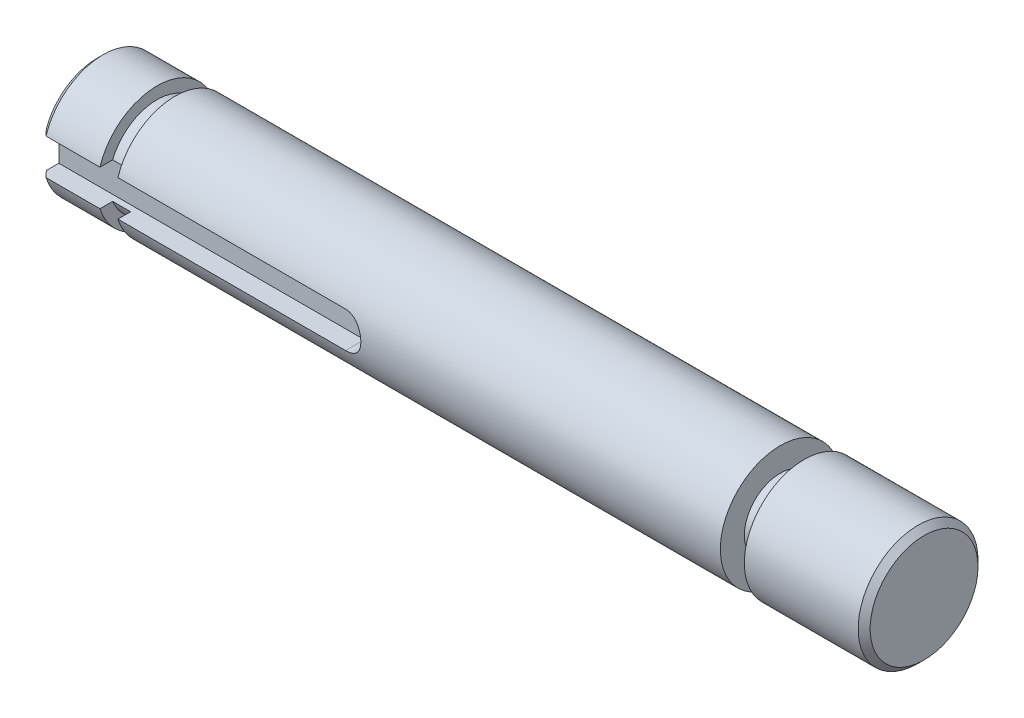
ISO-10303-21;
HEADER;
FILE_DESCRIPTION(('STEP AP214'),'2;1');
FILE_NAME('part.step','',(''),(''),'','','');
FILE_SCHEMA(('AUTOMOTIVE_DESIGN { 1 0 10303 214 1 1 1 1 }'));
ENDSEC;
DATA;
#1=APPLICATION_CONTEXT('core data for automotive mechanical design processes');
#2=APPLICATION_PROTOCOL_DEFINITION('international standard','automotive_design',2000,#1);
#3=PRODUCT_CONTEXT('',#1,'mechanical');
#4=PRODUCT('Part','Part','',(#3));
#5=PRODUCT_RELATED_PRODUCT_CATEGORY('part','',(#4));
#6=PRODUCT_DEFINITION_FORMATION('','',#4);
#7=PRODUCT_DEFINITION_CONTEXT('part definition',#1,'design');
#8=PRODUCT_DEFINITION('design','',#6,#7);
#9=PRODUCT_DEFINITION_SHAPE('','',#8);
#10=(LENGTH_UNIT() NAMED_UNIT(*) SI_UNIT(.MILLI.,.METRE.));
#11=(NAMED_UNIT(*) PLANE_ANGLE_UNIT() SI_UNIT($,.RADIAN.));
#12=(NAMED_UNIT(*) SI_UNIT($,.STERADIAN.) SOLID_ANGLE_UNIT());
#13=UNCERTAINTY_MEASURE_WITH_UNIT(LENGTH_MEASURE(1.E-05),#10,'distance_accuracy_value','');
#14=(GEOMETRIC_REPRESENTATION_CONTEXT(3) GLOBAL_UNCERTAINTY_ASSIGNED_CONTEXT((#13)) GLOBAL_UNIT_ASSIGNED_CONTEXT((#10,
#11,#12)) REPRESENTATION_CONTEXT('',''));
#15=CARTESIAN_POINT('',(0.,0.,0.));
#16=DIRECTION('',(0.,0.,1.));
#17=DIRECTION('',(1.,0.,0.));
#18=AXIS2_PLACEMENT_3D('',#15,#16,#17);
#19=CARTESIAN_POINT('',(34.5,0.,0.));
#20=DIRECTION('',(-1.,0.,0.));
#21=DIRECTION('',(0.,0.,1.));
#22=AXIS2_PLACEMENT_3D('',#19,#20,#21);
#23=CYLINDRICAL_SURFACE('',#22,5.);
#24=CARTESIAN_POINT('',(22.5,0.,0.));
#25=DIRECTION('',(1.,0.,0.));
#26=DIRECTION('',(0.,0.,-1.));
#27=AXIS2_PLACEMENT_3D('',#24,#25,#26);
#28=CIRCLE('',#27,5.);
#29=CARTESIAN_POINT('',(22.5,0.,-5.));
#30=VERTEX_POINT('',#29);
#31=EDGE_CURVE('E183',#30,#30,#28,.T.);
#32=ORIENTED_EDGE('',*,*,#31,.F.);
#33=EDGE_LOOP('',(#32));
#34=FACE_BOUND('',#33,.T.);
#35=DIRECTION('',(-1.,0.,0.));
#36=VECTOR('',#35,1.);
#37=CARTESIAN_POINT('',(34.5,-1.5,4.76969600708473));
#38=LINE('',#37,#36);
#39=CARTESIAN_POINT('',(-28.,-1.5,4.76969600708473));
#40=VERTEX_POINT('',#39);
#41=CARTESIAN_POINT('',(-9.00000000000001,-1.5,4.76969600708473));
#42=VERTEX_POINT('',#41);
#43=EDGE_CURVE('E162',#40,#42,#38,.F.);
#44=ORIENTED_EDGE('',*,*,#43,.F.);
#45=CARTESIAN_POINT('',(-28.,0.,0.));
#46=DIRECTION('',(-1.,0.,0.));
#47=DIRECTION('',(0.,0.,1.));
#48=AXIS2_PLACEMENT_3D('',#45,#46,#47);
#49=CIRCLE('',#48,5.);
#50=CARTESIAN_POINT('',(-28.,1.5,4.76969600708473));
#51=VERTEX_POINT('',#50);
#52=EDGE_CURVE('E171',#51,#40,#49,.T.);
#53=ORIENTED_EDGE('',*,*,#52,.F.);
#54=DIRECTION('',(-1.,0.,0.));
#55=VECTOR('',#54,1.);
#56=CARTESIAN_POINT('',(34.5,1.5,4.76969600708473));
#57=LINE('',#56,#55);
#58=CARTESIAN_POINT('',(-9.00000000000001,1.5,4.76969600708473));
#59=VERTEX_POINT('',#58);
#60=EDGE_CURVE('E152',#59,#51,#57,.T.);
#61=ORIENTED_EDGE('',*,*,#60,.F.);
#62=CARTESIAN_POINT('',(-9.00000000000001,-1.5,4.76969600708473));
#63=CARTESIAN_POINT('',(-8.95882060709199,-1.50000085357071,4.76969249084934));
#64=CARTESIAN_POINT('',(-8.91766195687388,-1.49830317083428,4.77022997000129));
#65=CARTESIAN_POINT('',(-8.83565883790444,-1.49153785660317,4.77235095109999));
#66=CARTESIAN_POINT('',(-8.79481430060511,-1.48647098275841,4.77393421787376));
#67=CARTESIAN_POINT('',(-8.67340945904534,-1.46630203689311,4.78018490618873));
#68=CARTESIAN_POINT('',(-8.59369360958363,-1.44623120413662,4.78635370384275));
#69=CARTESIAN_POINT('',(-8.43896442161414,-1.39353102315626,4.80195952113208));
#70=CARTESIAN_POINT('',(-8.36394944780192,-1.36090607068203,4.81139539670393));
#71=CARTESIAN_POINT('',(-8.22040331840241,-1.28407841117655,4.83246571212052));
#72=CARTESIAN_POINT('',(-8.15187520027157,-1.23987031651226,4.84410117434933));
#73=CARTESIAN_POINT('',(-8.02113394400295,-1.13964850658326,4.86866835244721));
#74=CARTESIAN_POINT('',(-7.95915633965661,-1.08333433465208,4.88162755412974));
#75=CARTESIAN_POINT('',(-7.84536441610004,-0.961138919873354,4.90714811559049));
#76=CARTESIAN_POINT('',(-7.79355181399695,-0.895256063916348,4.91970940785249));
#77=CARTESIAN_POINT('',(-7.70053622968151,-0.75410992131543,4.94333239727705));
#78=CARTESIAN_POINT('',(-7.65957481970205,-0.678680819336259,4.95435770971354));
#79=CARTESIAN_POINT('',(-7.59101158838185,-0.521621185505775,4.97334469846208));
#80=CARTESIAN_POINT('',(-7.56340632220573,-0.439992259012928,4.98130716463903));
#81=CARTESIAN_POINT('',(-7.52312020089796,-0.275324697874879,4.99307639935002));
#82=CARTESIAN_POINT('',(-7.51003514203026,-0.192393125294255,4.99699549276993));
#83=CARTESIAN_POINT('',(-7.49788265863674,-0.025423571998083,5.00063202022426));
#84=CARTESIAN_POINT('',(-7.49881258029984,0.0586141962423612,5.00035024971471));
#85=CARTESIAN_POINT('',(-7.514392908759,0.222571599946015,4.99569602566267));
#86=CARTESIAN_POINT('',(-7.52860534497872,0.30253714546464,4.99145415509187));
#87=CARTESIAN_POINT('',(-7.56963163523811,0.458890052102024,4.9795151369998));
#88=CARTESIAN_POINT('',(-7.59644614945594,0.535277225531996,4.97181780846028));
#89=CARTESIAN_POINT('',(-7.66221222164644,0.683347815892215,4.95365214926145));
#90=CARTESIAN_POINT('',(-7.70130164435695,0.754966006044141,4.94315255692525));
#91=CARTESIAN_POINT('',(-7.79039859004832,0.890765529574419,4.92049624651755));
#92=CARTESIAN_POINT('',(-7.84040855947884,0.954945191614594,4.90833915735884));
#93=CARTESIAN_POINT('',(-7.95219198808351,1.07665450541275,4.88311673571409));
#94=CARTESIAN_POINT('',(-8.01434386376075,1.13383351478034,4.87003445449554));
#95=CARTESIAN_POINT('',(-8.14749742342792,1.23706769492487,4.84484215114658));
#96=CARTESIAN_POINT('',(-8.21850168036553,1.28311962013078,4.83273241337565));
#97=CARTESIAN_POINT('',(-8.36828092844929,1.36316407240863,4.81077228795653));
#98=CARTESIAN_POINT('',(-8.44712717959341,1.39703006341135,4.80094596245948));
#99=CARTESIAN_POINT('',(-8.60972450398175,1.45085886004699,4.78495663653201));
#100=CARTESIAN_POINT('',(-8.69346786071438,1.47084293218035,4.77878803475875));
#101=CARTESIAN_POINT('',(-8.81499488907019,1.4890120359008,4.77314032325006));
#102=CARTESIAN_POINT('',(-8.85189073417961,1.49313202989009,4.77185156275267));
#103=CARTESIAN_POINT('',(-8.92585147909953,1.49862355614854,4.77012928611782));
#104=CARTESIAN_POINT('',(-8.96291604966386,1.49999912968269,4.76969451246644));
#105=CARTESIAN_POINT('',(-9.00000000000001,1.5,4.76969600708473));
#106=B_SPLINE_CURVE_WITH_KNOTS('',3,(#62,#63,#64,#65,#66,#67,#68,#69,#70,#71,#72,#73,#74,#75,
#76,#77,#78,#79,#80,#81,#82,#83,#84,#85,#86,#87,#88,#89,#90,#91,#92,#93,#94,#95,#96,#97,#98,#99,
#100,#101,#102,#103,#104,#105),.UNSPECIFIED.,.F.,.F.,(4,2,2,2,2,2,2,2,2,2,2,2,2,2,2,2,2,2,2,2,2,
4),(0.,0.123459071219734,0.246890388853043,0.49291134961521,0.738846245884323,0.984895736828092,
1.23795510798803,1.49105719006936,1.74939356197455,2.00766326783256,2.25854751319802,
2.5093842528947,2.75223130012966,2.99509107067835,3.2407824256273,3.48652887757004,
3.74172568310981,3.99699683536777,4.25484698071527,4.51230123440207,4.62365084745809,
4.73483637253615),.UNSPECIFIED.);
#107=EDGE_CURVE('E11',#42,#59,#106,.T.);
#108=ORIENTED_EDGE('',*,*,#107,.F.);
#109=EDGE_LOOP('',(#44,#53,#61,#108));
#110=FACE_BOUND('',#109,.T.);
#111=ADVANCED_FACE('F37',(#34,#110),#23,.T.);
#112=CARTESIAN_POINT('',(-28.,0.,0.));
#113=DIRECTION('',(-1.,0.,0.));
#114=DIRECTION('',(0.,0.,1.));
#115=AXIS2_PLACEMENT_3D('',#112,#113,#114);
#116=PLANE('',#115);
#117=ORIENTED_EDGE('',*,*,#52,.T.);
#118=DIRECTION('',(0.,0.,-1.));
#119=VECTOR('',#118,1.);
#120=CARTESIAN_POINT('',(-28.,-1.5,0.));
#121=LINE('',#120,#119);
#122=CARTESIAN_POINT('',(-28.,-1.5,3.70809924354783));
#123=VERTEX_POINT('',#122);
#124=EDGE_CURVE('E66',#40,#123,#121,.T.);
#125=ORIENTED_EDGE('',*,*,#124,.T.);
#126=CARTESIAN_POINT('',(-28.,0.,0.));
#127=DIRECTION('',(-1.,0.,0.));
#128=DIRECTION('',(0.,0.,1.));
#129=AXIS2_PLACEMENT_3D('',#126,#127,#128);
#130=CIRCLE('',#129,4.);
#131=CARTESIAN_POINT('',(-28.,1.5,3.70809924354783));
#132=VERTEX_POINT('',#131);
#133=EDGE_CURVE('E165',#132,#123,#130,.T.);
#134=ORIENTED_EDGE('',*,*,#133,.F.);
#135=DIRECTION('',(0.,0.,1.));
#136=VECTOR('',#135,1.);
#137=CARTESIAN_POINT('',(-28.,1.5,0.));
#138=LINE('',#137,#136);
#139=EDGE_CURVE('E149',#132,#51,#138,.T.);
#140=ORIENTED_EDGE('',*,*,#139,.T.);
#141=EDGE_LOOP('',(#117,#125,#134,#140));
#142=FACE_BOUND('',#141,.T.);
#143=ADVANCED_FACE('F224',(#142),#116,.T.);
#144=CARTESIAN_POINT('',(-29.5,0.,0.));
#145=DIRECTION('',(-1.,0.,0.));
#146=DIRECTION('',(0.,0.,1.));
#147=AXIS2_PLACEMENT_3D('',#144,#145,#146);
#148=PLANE('',#147);
#149=DIRECTION('',(0.,0.,-1.));
#150=VECTOR('',#149,1.);
#151=CARTESIAN_POINT('',(-29.5,-1.5,0.));
#152=LINE('',#151,#150);
#153=CARTESIAN_POINT('',(-29.5,-1.5,4.76969600708473));
#154=VERTEX_POINT('',#153);
#155=CARTESIAN_POINT('',(-29.5,-1.5,3.70809924354783));
#156=VERTEX_POINT('',#155);
#157=EDGE_CURVE('E156',#154,#156,#152,.T.);
#158=ORIENTED_EDGE('',*,*,#157,.F.);
#159=CARTESIAN_POINT('',(-29.5,0.,0.));
#160=DIRECTION('',(-1.,0.,0.));
#161=DIRECTION('',(0.,0.,1.));
#162=AXIS2_PLACEMENT_3D('',#159,#160,#161);
#163=CIRCLE('',#162,5.);
#164=CARTESIAN_POINT('',(-29.5,1.5,4.76969600708473));
#165=VERTEX_POINT('',#164);
#166=EDGE_CURVE('E168',#165,#154,#163,.T.);
#167=ORIENTED_EDGE('',*,*,#166,.F.);
#168=DIRECTION('',(0.,0.,1.));
#169=VECTOR('',#168,1.);
#170=CARTESIAN_POINT('',(-29.5,1.5,0.));
#171=LINE('',#170,#169);
#172=CARTESIAN_POINT('',(-29.5,1.5,3.70809924354783));
#173=VERTEX_POINT('',#172);
#174=EDGE_CURVE('E139',#173,#165,#171,.T.);
#175=ORIENTED_EDGE('',*,*,#174,.F.);
#176=CARTESIAN_POINT('',(-29.5,0.,0.));
#177=DIRECTION('',(-1.,0.,0.));
#178=DIRECTION('',(0.,0.,1.));
#179=AXIS2_PLACEMENT_3D('',#176,#177,#178);
#180=CIRCLE('',#179,4.);
#181=EDGE_CURVE('E164',#173,#156,#180,.T.);
#182=ORIENTED_EDGE('',*,*,#181,.T.);
#183=EDGE_LOOP('',(#158,#167,#175,#182));
#184=FACE_BOUND('',#183,.T.);
#185=ADVANCED_FACE('F222',(#184),#148,.F.);
#186=CARTESIAN_POINT('',(-28.,0.,0.));
#187=DIRECTION('',(-1.,0.,0.));
#188=DIRECTION('',(0.,0.,1.));
#189=AXIS2_PLACEMENT_3D('',#186,#187,#188);
#190=CYLINDRICAL_SURFACE('',#189,4.);
#191=ORIENTED_EDGE('',*,*,#133,.T.);
#192=DIRECTION('',(-1.,0.,0.));
#193=VECTOR('',#192,1.);
#194=CARTESIAN_POINT('',(-28.,-1.5,3.70809924354783));
#195=LINE('',#194,#193);
#196=EDGE_CURVE('E158',#123,#156,#195,.T.);
#197=ORIENTED_EDGE('',*,*,#196,.T.);
#198=ORIENTED_EDGE('',*,*,#181,.F.);
#199=DIRECTION('',(-1.,0.,0.));
#200=VECTOR('',#199,1.);
#201=CARTESIAN_POINT('',(-28.,1.5,3.70809924354783));
#202=LINE('',#201,#200);
#203=EDGE_CURVE('E146',#173,#132,#202,.F.);
#204=ORIENTED_EDGE('',*,*,#203,.T.);
#205=EDGE_LOOP('',(#191,#197,#198,#204));
#206=FACE_BOUND('',#205,.T.);
#207=ADVANCED_FACE('F219',(#206),#190,.T.);
#208=CARTESIAN_POINT('',(-34.5,0.,0.));
#209=DIRECTION('',(1.,0.,0.));
#210=DIRECTION('',(0.,0.,-1.));
#211=AXIS2_PLACEMENT_3D('',#208,#209,#210);
#212=PLANE('',#211);
#213=DIRECTION('',(0.,0.,-1.));
#214=VECTOR('',#213,1.);
#215=CARTESIAN_POINT('',(-34.5,-1.5,5.));
#216=LINE('',#215,#214);
#217=CARTESIAN_POINT('',(-34.5,-1.5,4.24264068711928));
#218=VERTEX_POINT('',#217);
#219=CARTESIAN_POINT('',(-34.5,-1.5,3.2));
#220=VERTEX_POINT('',#219);
#221=EDGE_CURVE('E116',#218,#220,#216,.T.);
#222=ORIENTED_EDGE('',*,*,#221,.T.);
#223=DIRECTION('',(0.,-1.,0.));
#224=VECTOR('',#223,1.);
#225=CARTESIAN_POINT('',(-34.5,1.5,3.2));
#226=LINE('',#225,#224);
#227=CARTESIAN_POINT('',(-34.5,1.5,3.2));
#228=VERTEX_POINT('',#227);
#229=EDGE_CURVE('E124',#228,#220,#226,.T.);
#230=ORIENTED_EDGE('',*,*,#229,.F.);
#231=DIRECTION('',(0.,0.,-1.));
#232=VECTOR('',#231,1.);
#233=CARTESIAN_POINT('',(-34.5,1.5,5.));
#234=LINE('',#233,#232);
#235=CARTESIAN_POINT('',(-34.5,1.5,4.24264068711928));
#236=VERTEX_POINT('',#235);
#237=EDGE_CURVE('E275',#236,#228,#234,.T.);
#238=ORIENTED_EDGE('',*,*,#237,.F.);
#239=CARTESIAN_POINT('',(-34.5,0.,0.));
#240=DIRECTION('',(1.,0.,0.));
#241=DIRECTION('',(0.,0.,-1.));
#242=AXIS2_PLACEMENT_3D('',#239,#240,#241);
#243=CIRCLE('',#242,4.5);
#244=EDGE_CURVE('E137',#236,#218,#243,.F.);
#245=ORIENTED_EDGE('',*,*,#244,.T.);
#246=EDGE_LOOP('',(#222,#230,#238,#245));
#247=FACE_BOUND('',#246,.T.);
#248=ADVANCED_FACE('F135',(#247),#212,.F.);
#249=DIRECTION('',(-1.,0.,0.));
#250=VECTOR('',#249,1.);
#251=CARTESIAN_POINT('',(34.5,-1.5,4.76969600708473));
#252=LINE('',#251,#250);
#253=CARTESIAN_POINT('',(-34.,-1.5,4.76969600708473));
#254=VERTEX_POINT('',#253);
#255=EDGE_CURVE('E154',#254,#154,#252,.F.);
#256=ORIENTED_EDGE('',*,*,#255,.F.);
#257=CARTESIAN_POINT('',(-34.,0.,0.));
#258=DIRECTION('',(1.,0.,0.));
#259=DIRECTION('',(0.,0.,-1.));
#260=AXIS2_PLACEMENT_3D('',#257,#258,#259);
#261=CIRCLE('',#260,5.);
#262=CARTESIAN_POINT('',(-34.,1.5,4.76969600708473));
#263=VERTEX_POINT('',#262);
#264=EDGE_CURVE('E194',#254,#263,#261,.T.);
#265=ORIENTED_EDGE('',*,*,#264,.T.);
#266=DIRECTION('',(-1.,0.,0.));
#267=VECTOR('',#266,1.);
#268=CARTESIAN_POINT('',(34.5,1.5,4.76969600708473));
#269=LINE('',#268,#267);
#270=EDGE_CURVE('E58',#165,#263,#269,.T.);
#271=ORIENTED_EDGE('',*,*,#270,.F.);
#272=ORIENTED_EDGE('',*,*,#166,.T.);
#273=EDGE_LOOP('',(#256,#265,#271,#272));
#274=FACE_BOUND('',#273,.T.);
#275=ADVANCED_FACE('F249',(#274),#23,.T.);
#276=CARTESIAN_POINT('',(-34.,0.,0.));
#277=DIRECTION('',(1.,0.,0.));
#278=DIRECTION('',(0.,0.,-1.));
#279=AXIS2_PLACEMENT_3D('',#276,#277,#278);
#280=CONICAL_SURFACE('',#279,5.,0.785398163397451);
#281=ORIENTED_EDGE('',*,*,#264,.F.);
#282=CARTESIAN_POINT('',(-31.8609473171126,-1.5,6.97969005107262));
#283=CARTESIAN_POINT('',(-32.0690052900893,-1.5,6.76685846964306));
#284=CARTESIAN_POINT('',(-32.2768708615187,-1.5,6.55383788587082));
#285=CARTESIAN_POINT('',(-32.6920123009123,-1.5,6.12725063306097));
#286=CARTESIAN_POINT('',(-32.8992882071887,-1.5,5.9136840012966));
#287=CARTESIAN_POINT('',(-33.3129705368911,-1.5,5.48591440945267));
#288=CARTESIAN_POINT('',(-33.519377340571,-1.5,5.2717118175118));
#289=CARTESIAN_POINT('',(-33.9311150771752,-1.5,4.84224439352639));
#290=CARTESIAN_POINT('',(-34.1364459303664,-1.5,4.62697948499158));
#291=CARTESIAN_POINT('',(-34.5456625222699,-1.5,4.19476087473618));
#292=CARTESIAN_POINT('',(-34.7495470263421,-1.5,3.97780600015097));
#293=CARTESIAN_POINT('',(-35.0534378048551,-1.5,3.65061096884927));
#294=CARTESIAN_POINT('',(-35.1544031148046,-1.5,3.54126204128286));
#295=CARTESIAN_POINT('',(-35.3555012481673,-1.5,3.32179359398856));
#296=CARTESIAN_POINT('',(-35.4556340444719,-1.5,3.21167404938083));
#297=CARTESIAN_POINT('',(-35.6548638106812,-1.5,2.99036108474282));
#298=CARTESIAN_POINT('',(-35.7539600067692,-1.5,2.8791669672139));
#299=CARTESIAN_POINT('',(-35.9506379072296,-1.5,2.6554592565589));
#300=CARTESIAN_POINT('',(-36.0482197474772,-1.5,2.54294578342071));
#301=CARTESIAN_POINT('',(-36.1930149701006,-1.5,2.37277183064053));
#302=CARTESIAN_POINT('',(-36.2410318728437,-1.5,2.31579520626766));
#303=CARTESIAN_POINT('',(-36.336410412246,-1.5,2.20129812592812));
#304=CARTESIAN_POINT('',(-36.3837720671063,-1.5,2.14377768514221));
#305=CARTESIAN_POINT('',(-36.4777140489333,-1.5,2.02807141801446));
#306=CARTESIAN_POINT('',(-36.5242941352244,-1.5,1.96988539566466));
#307=CARTESIAN_POINT('',(-36.6164558953132,-1.5,1.85271977151891));
#308=CARTESIAN_POINT('',(-36.6620374724692,-1.5,1.7937400937922));
#309=CARTESIAN_POINT('',(-36.7070140779739,-1.5,1.73429652557168));
#310=B_SPLINE_CURVE_WITH_KNOTS('',3,(#282,#283,#284,#285,#286,#287,#288,#289,#290,#291,#292,
#293,#294,#295,#296,#297,#298,#299,#300,#301,#302,#303,#304,#305,#306,#307,#308,#309),
.UNSPECIFIED.,.F.,.F.,(4,2,2,2,2,2,2,2,2,2,2,2,2,4),(0.,0.892899837982891,1.78574027241743,
2.67813788006184,3.5706007090967,4.46375081632205,4.91024592323061,5.35675551262279,
5.80357753465277,6.25035923115377,6.47388976350277,6.69741407425855,6.92100599838937,
7.14461946832471),.UNSPECIFIED.);
#311=EDGE_CURVE('E51',#254,#218,#310,.T.);
#312=ORIENTED_EDGE('',*,*,#311,.T.);
#313=ORIENTED_EDGE('',*,*,#244,.F.);
#314=CARTESIAN_POINT('',(-36.7070140779739,1.5,1.73429652557168));
#315=CARTESIAN_POINT('',(-36.6731320660261,1.5,1.77908693888236));
#316=CARTESIAN_POINT('',(-36.638900551902,1.5,1.82361036804484));
#317=CARTESIAN_POINT('',(-36.5698385854765,1.5,1.91218682312016));
#318=CARTESIAN_POINT('',(-36.535008164866,1.5,1.9562398737242));
#319=CARTESIAN_POINT('',(-36.429777402497,1.5,2.08777808501949));
#320=CARTESIAN_POINT('',(-36.3586237662692,1.5,2.17466038152806));
#321=CARTESIAN_POINT('',(-36.2148824831828,1.5,2.34715722091075));
#322=CARTESIAN_POINT('',(-36.142295508272,1.5,2.43277232638572));
#323=CARTESIAN_POINT('',(-35.9960055754008,1.5,2.60305076304625));
#324=CARTESIAN_POINT('',(-35.922302551641,1.5,2.6877140375974));
#325=CARTESIAN_POINT('',(-35.7000248776767,1.5,2.94046166043097));
#326=CARTESIAN_POINT('',(-35.5501783529503,1.5,3.10742612228458));
#327=CARTESIAN_POINT('',(-35.2483420576352,1.5,3.43942871545457));
#328=CARTESIAN_POINT('',(-35.0963520574344,1.5,3.60446663688281));
#329=CARTESIAN_POINT('',(-34.8936868957398,1.5,3.82259025149471));
#330=CARTESIAN_POINT('',(-34.8436588755591,1.5,3.87627856474981));
#331=CARTESIAN_POINT('',(-34.7434647717696,1.5,3.98352350180323));
#332=CARTESIAN_POINT('',(-34.6932986919759,1.5,4.03708012916457));
#333=CARTESIAN_POINT('',(-34.542603266947,1.5,4.19758760920787));
#334=CARTESIAN_POINT('',(-34.4418880268484,1.5,4.30436392171742));
#335=CARTESIAN_POINT('',(-34.1363681367456,1.5,4.62707098042187));
#336=CARTESIAN_POINT('',(-33.9309496354163,1.5,4.84242035233032));
#337=CARTESIAN_POINT('',(-33.5190245458365,1.5,5.27207641108814));
#338=CARTESIAN_POINT('',(-33.3125179511522,1.5,5.48638309175751));
#339=CARTESIAN_POINT('',(-32.898818107301,1.5,5.91416941738405));
#340=CARTESIAN_POINT('',(-32.6916251594587,1.5,6.12764935393667));
#341=CARTESIAN_POINT('',(-32.2766677830417,1.5,6.5540456763219));
#342=CARTESIAN_POINT('',(-32.0689033649537,1.5,6.76696207235696));
#343=CARTESIAN_POINT('',(-31.8609473171126,1.5,6.97969005107262));
#344=B_SPLINE_CURVE_WITH_KNOTS('',3,(#314,#315,#316,#317,#318,#319,#320,#321,#322,#323,#324,
#325,#326,#327,#328,#329,#330,#331,#332,#333,#334,#335,#336,#337,#338,#339,#340,#341,#342,#343),
.UNSPECIFIED.,.F.,.F.,(4,2,2,2,2,2,2,2,2,2,2,2,2,2,4),(0.,0.168481178560409,0.336953469263773,
0.67382985489428,1.01055189600276,1.34729386731285,2.02029767349438,2.69337412875385,
2.91352652434992,3.13367289622909,3.57401537215846,4.46684087004097,5.35967165323347,
6.25215200141002,7.1446160799062),.UNSPECIFIED.);
#345=EDGE_CURVE('E198',#236,#263,#344,.T.);
#346=ORIENTED_EDGE('',*,*,#345,.T.);
#347=EDGE_LOOP('',(#281,#312,#313,#346));
#348=FACE_BOUND('',#347,.T.);
#349=ADVANCED_FACE('F39',(#348),#280,.T.);
#350=CARTESIAN_POINT('',(22.5,0.,0.));
#351=DIRECTION('',(1.,0.,0.));
#352=DIRECTION('',(0.,0.,-1.));
#353=AXIS2_PLACEMENT_3D('',#350,#351,#352);
#354=PLANE('',#353);
#355=CARTESIAN_POINT('',(22.5,0.,0.));
#356=DIRECTION('',(1.,0.,0.));
#357=DIRECTION('',(0.,0.,-1.));
#358=AXIS2_PLACEMENT_3D('',#355,#356,#357);
#359=CIRCLE('',#358,3.);
#360=CARTESIAN_POINT('',(22.5,0.,-3.));
#361=VERTEX_POINT('',#360);
#362=EDGE_CURVE('E177',#361,#361,#359,.T.);
#363=ORIENTED_EDGE('',*,*,#362,.F.);
#364=EDGE_LOOP('',(#363));
#365=FACE_BOUND('',#364,.T.);
#366=ORIENTED_EDGE('',*,*,#31,.T.);
#367=EDGE_LOOP('',(#366));
#368=FACE_BOUND('',#367,.T.);
#369=ADVANCED_FACE('F237',(#365,#368),#354,.T.);
#370=CARTESIAN_POINT('',(24.5,0.,0.));
#371=DIRECTION('',(1.,0.,0.));
#372=DIRECTION('',(0.,0.,-1.));
#373=AXIS2_PLACEMENT_3D('',#370,#371,#372);
#374=PLANE('',#373);
#375=CARTESIAN_POINT('',(24.5,0.,0.));
#376=DIRECTION('',(1.,0.,0.));
#377=DIRECTION('',(0.,0.,-1.));
#378=AXIS2_PLACEMENT_3D('',#375,#376,#377);
#379=CIRCLE('',#378,3.);
#380=CARTESIAN_POINT('',(24.5,0.,-3.));
#381=VERTEX_POINT('',#380);
#382=EDGE_CURVE('E174',#381,#381,#379,.T.);
#383=ORIENTED_EDGE('',*,*,#382,.T.);
#384=EDGE_LOOP('',(#383));
#385=FACE_BOUND('',#384,.T.);
#386=CARTESIAN_POINT('',(24.5,0.,0.));
#387=DIRECTION('',(1.,0.,0.));
#388=DIRECTION('',(0.,0.,-1.));
#389=AXIS2_PLACEMENT_3D('',#386,#387,#388);
#390=CIRCLE('',#389,5.);
#391=CARTESIAN_POINT('',(24.5,0.,-5.));
#392=VERTEX_POINT('',#391);
#393=EDGE_CURVE('E180',#392,#392,#390,.T.);
#394=ORIENTED_EDGE('',*,*,#393,.F.);
#395=EDGE_LOOP('',(#394));
#396=FACE_BOUND('',#395,.T.);
#397=ADVANCED_FACE('F235',(#385,#396),#374,.F.);
#398=CARTESIAN_POINT('',(22.5,0.,0.));
#399=DIRECTION('',(1.,0.,0.));
#400=DIRECTION('',(0.,0.,-1.));
#401=AXIS2_PLACEMENT_3D('',#398,#399,#400);
#402=CYLINDRICAL_SURFACE('',#401,3.);
#403=ORIENTED_EDGE('',*,*,#362,.T.);
#404=EDGE_LOOP('',(#403));
#405=FACE_BOUND('',#404,.T.);
#406=ORIENTED_EDGE('',*,*,#382,.F.);
#407=EDGE_LOOP('',(#406));
#408=FACE_BOUND('',#407,.T.);
#409=ADVANCED_FACE('F231',(#405,#408),#402,.T.);
#410=CARTESIAN_POINT('',(34.5,0.,0.));
#411=DIRECTION('',(1.,0.,0.));
#412=DIRECTION('',(0.,0.,-1.));
#413=AXIS2_PLACEMENT_3D('',#410,#411,#412);
#414=PLANE('',#413);
#415=CARTESIAN_POINT('',(34.5,0.,0.));
#416=DIRECTION('',(1.,0.,0.));
#417=DIRECTION('',(0.,0.,-1.));
#418=AXIS2_PLACEMENT_3D('',#415,#416,#417);
#419=CIRCLE('',#418,4.50000000000002);
#420=CARTESIAN_POINT('',(34.5,0.,-4.50000000000002));
#421=VERTEX_POINT('',#420);
#422=EDGE_CURVE('E186',#421,#421,#419,.T.);
#423=ORIENTED_EDGE('',*,*,#422,.T.);
#424=EDGE_LOOP('',(#423));
#425=FACE_BOUND('',#424,.T.);
#426=ADVANCED_FACE('F234',(#425),#414,.T.);
#427=CARTESIAN_POINT('',(34.,0.,0.));
#428=DIRECTION('',(1.,0.,0.));
#429=DIRECTION('',(0.,0.,-1.));
#430=AXIS2_PLACEMENT_3D('',#427,#428,#429);
#431=CIRCLE('',#430,5.);
#432=CARTESIAN_POINT('',(34.,0.,-5.));
#433=VERTEX_POINT('',#432);
#434=EDGE_CURVE('E191',#433,#433,#431,.F.);
#435=ORIENTED_EDGE('',*,*,#434,.T.);
#436=EDGE_LOOP('',(#435));
#437=FACE_BOUND('',#436,.T.);
#438=ORIENTED_EDGE('',*,*,#393,.T.);
#439=EDGE_LOOP('',(#438));
#440=FACE_BOUND('',#439,.T.);
#441=ADVANCED_FACE('F246',(#437,#440),#23,.T.);
#442=CARTESIAN_POINT('',(34.5,0.,0.));
#443=DIRECTION('',(-1.,0.,0.));
#444=DIRECTION('',(0.,0.,1.));
#445=AXIS2_PLACEMENT_3D('',#442,#443,#444);
#446=CONICAL_SURFACE('',#445,4.50000000000002,0.785398163397444);
#447=ORIENTED_EDGE('',*,*,#434,.F.);
#448=EDGE_LOOP('',(#447));
#449=FACE_BOUND('',#448,.T.);
#450=ORIENTED_EDGE('',*,*,#422,.F.);
#451=EDGE_LOOP('',(#450));
#452=FACE_BOUND('',#451,.T.);
#453=ADVANCED_FACE('F214',(#449,#452),#446,.T.);
#454=CARTESIAN_POINT('',(-9.00000000000001,0.,5.));
#455=DIRECTION('',(0.,0.,-1.));
#456=DIRECTION('',(-1.,0.,0.));
#457=AXIS2_PLACEMENT_3D('',#454,#455,#456);
#458=CYLINDRICAL_SURFACE('',#457,1.5);
#459=DIRECTION('',(0.,0.,-1.));
#460=VECTOR('',#459,1.);
#461=CARTESIAN_POINT('',(-9.00000000000001,-1.5,5.));
#462=LINE('',#461,#460);
#463=CARTESIAN_POINT('',(-9.00000000000001,-1.5,3.2));
#464=VERTEX_POINT('',#463);
#465=EDGE_CURVE('E119',#42,#464,#462,.T.);
#466=ORIENTED_EDGE('',*,*,#465,.F.);
#467=ORIENTED_EDGE('',*,*,#107,.T.);
#468=DIRECTION('',(0.,0.,-1.));
#469=VECTOR('',#468,1.);
#470=CARTESIAN_POINT('',(-9.00000000000001,1.5,5.));
#471=LINE('',#470,#469);
#472=CARTESIAN_POINT('',(-9.00000000000001,1.5,3.2));
#473=VERTEX_POINT('',#472);
#474=EDGE_CURVE('E141',#59,#473,#471,.T.);
#475=ORIENTED_EDGE('',*,*,#474,.T.);
#476=CARTESIAN_POINT('',(-9.00000000000001,0.,3.2));
#477=DIRECTION('',(0.,0.,1.));
#478=DIRECTION('',(1.,0.,0.));
#479=AXIS2_PLACEMENT_3D('',#476,#477,#478);
#480=CIRCLE('',#479,1.5);
#481=EDGE_CURVE('E123',#464,#473,#480,.T.);
#482=ORIENTED_EDGE('',*,*,#481,.F.);
#483=EDGE_LOOP('',(#466,#467,#475,#482));
#484=FACE_BOUND('',#483,.T.);
#485=ADVANCED_FACE('F211',(#484),#458,.F.);
#486=CARTESIAN_POINT('',(-34.5,-1.5,5.));
#487=DIRECTION('',(0.,1.,0.));
#488=DIRECTION('',(0.,0.,1.));
#489=AXIS2_PLACEMENT_3D('',#486,#487,#488);
#490=PLANE('',#489);
#491=ORIENTED_EDGE('',*,*,#43,.T.);
#492=ORIENTED_EDGE('',*,*,#465,.T.);
#493=DIRECTION('',(1.,0.,0.));
#494=VECTOR('',#493,1.);
#495=CARTESIAN_POINT('',(-34.5,-1.5,3.2));
#496=LINE('',#495,#494);
#497=EDGE_CURVE('E112',#220,#464,#496,.T.);
#498=ORIENTED_EDGE('',*,*,#497,.F.);
#499=ORIENTED_EDGE('',*,*,#221,.F.);
#500=ORIENTED_EDGE('',*,*,#311,.F.);
#501=ORIENTED_EDGE('',*,*,#255,.T.);
#502=ORIENTED_EDGE('',*,*,#157,.T.);
#503=ORIENTED_EDGE('',*,*,#196,.F.);
#504=ORIENTED_EDGE('',*,*,#124,.F.);
#505=EDGE_LOOP('',(#491,#492,#498,#499,#500,#501,#502,#503,#504));
#506=FACE_BOUND('',#505,.T.);
#507=ADVANCED_FACE('F114',(#506),#490,.T.);
#508=CARTESIAN_POINT('',(-34.5,1.5,5.));
#509=DIRECTION('',(0.,-1.,0.));
#510=DIRECTION('',(0.,0.,-1.));
#511=AXIS2_PLACEMENT_3D('',#508,#509,#510);
#512=PLANE('',#511);
#513=ORIENTED_EDGE('',*,*,#60,.T.);
#514=ORIENTED_EDGE('',*,*,#139,.F.);
#515=ORIENTED_EDGE('',*,*,#203,.F.);
#516=ORIENTED_EDGE('',*,*,#174,.T.);
#517=ORIENTED_EDGE('',*,*,#270,.T.);
#518=ORIENTED_EDGE('',*,*,#345,.F.);
#519=ORIENTED_EDGE('',*,*,#237,.T.);
#520=DIRECTION('',(-1.,0.,0.));
#521=VECTOR('',#520,1.);
#522=CARTESIAN_POINT('',(-34.5,1.5,3.2));
#523=LINE('',#522,#521);
#524=EDGE_CURVE('E130',#473,#228,#523,.T.);
#525=ORIENTED_EDGE('',*,*,#524,.F.);
#526=ORIENTED_EDGE('',*,*,#474,.F.);
#527=EDGE_LOOP('',(#513,#514,#515,#516,#517,#518,#519,#525,#526));
#528=FACE_BOUND('',#527,.T.);
#529=ADVANCED_FACE('F207',(#528),#512,.T.);
#530=CARTESIAN_POINT('',(-9.00000000000001,0.,3.2));
#531=DIRECTION('',(0.,0.,1.));
#532=DIRECTION('',(1.,0.,0.));
#533=AXIS2_PLACEMENT_3D('',#530,#531,#532);
#534=PLANE('',#533);
#535=ORIENTED_EDGE('',*,*,#229,.T.);
#536=ORIENTED_EDGE('',*,*,#497,.T.);
#537=ORIENTED_EDGE('',*,*,#481,.T.);
#538=ORIENTED_EDGE('',*,*,#524,.T.);
#539=EDGE_LOOP('',(#535,#536,#537,#538));
#540=FACE_BOUND('',#539,.T.);
#541=ADVANCED_FACE('F128',(#540),#534,.T.);
#542=CLOSED_SHELL('',(#111,#143,#185,#207,#248,#275,#349,#369,#397,#409,#426,#441,#453,#485,
#507,#529,#541));
#543=MANIFOLD_SOLID_BREP('B2',#542);
#544=ADVANCED_BREP_SHAPE_REPRESENTATION('',(#18,#543),#14);
#545=SHAPE_DEFINITION_REPRESENTATION(#9,#544);
ENDSEC;
END-ISO-10303-21;
